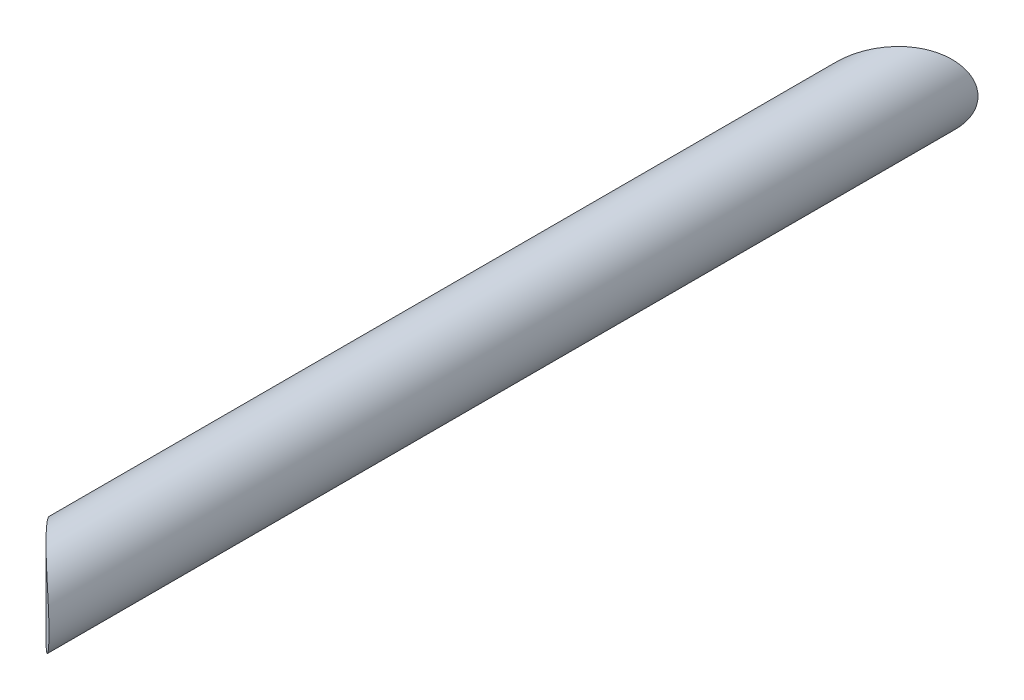
ISO-10303-21;
HEADER;
FILE_DESCRIPTION(('STEP AP214'),'2;1');
FILE_NAME('part.step','',(''),(''),'','','');
FILE_SCHEMA(('AUTOMOTIVE_DESIGN { 1 0 10303 214 1 1 1 1 }'));
ENDSEC;
DATA;
#1=APPLICATION_CONTEXT('core data for automotive mechanical design processes');
#2=APPLICATION_PROTOCOL_DEFINITION('international standard','automotive_design',2000,#1);
#3=PRODUCT_CONTEXT('',#1,'mechanical');
#4=PRODUCT('Part','Part','',(#3));
#5=PRODUCT_RELATED_PRODUCT_CATEGORY('part','',(#4));
#6=PRODUCT_DEFINITION_FORMATION('','',#4);
#7=PRODUCT_DEFINITION_CONTEXT('part definition',#1,'design');
#8=PRODUCT_DEFINITION('design','',#6,#7);
#9=PRODUCT_DEFINITION_SHAPE('','',#8);
#10=(LENGTH_UNIT() NAMED_UNIT(*) SI_UNIT(.MILLI.,.METRE.));
#11=(NAMED_UNIT(*) PLANE_ANGLE_UNIT() SI_UNIT($,.RADIAN.));
#12=(NAMED_UNIT(*) SI_UNIT($,.STERADIAN.) SOLID_ANGLE_UNIT());
#13=UNCERTAINTY_MEASURE_WITH_UNIT(LENGTH_MEASURE(1.E-05),#10,'distance_accuracy_value','');
#14=(GEOMETRIC_REPRESENTATION_CONTEXT(3) GLOBAL_UNCERTAINTY_ASSIGNED_CONTEXT((#13)) GLOBAL_UNIT_ASSIGNED_CONTEXT((#10,
#11,#12)) REPRESENTATION_CONTEXT('',''));
#15=CARTESIAN_POINT('',(0.,0.,0.));
#16=DIRECTION('',(0.,0.,1.));
#17=DIRECTION('',(1.,0.,0.));
#18=AXIS2_PLACEMENT_3D('',#15,#16,#17);
#19=CARTESIAN_POINT('',(-24.9877556700149,5.00000223932676,-32.0000821709314));
#20=DIRECTION('',(0.,0.,1.));
#21=DIRECTION('',(1.,0.,0.));
#22=AXIS2_PLACEMENT_3D('',#19,#20,#21);
#23=CYLINDRICAL_SURFACE('',#22,1.92);
#24=CARTESIAN_POINT('',(-23.0677556700149,5.00000223932676,21.3801329823359));
#25=CARTESIAN_POINT('',(-23.0677613947827,4.91104632216814,21.3801286327776));
#26=CARTESIAN_POINT('',(-23.0739907390176,4.82194466939428,21.3748651270311));
#27=CARTESIAN_POINT('',(-23.0984860418858,4.64652589615371,21.3541138972702));
#28=CARTESIAN_POINT('',(-23.1167811346777,4.56021604732927,21.3386014257683));
#29=CARTESIAN_POINT('',(-23.164047137535,4.39340548545309,21.2983537718751));
#30=CARTESIAN_POINT('',(-23.1929593350612,4.31287568253049,21.2736693018625));
#31=CARTESIAN_POINT('',(-23.259793251646,4.1588059357444,21.2162931039907));
#32=CARTESIAN_POINT('',(-23.2977147900889,4.08526585179513,21.1836015366543));
#33=CARTESIAN_POINT('',(-23.3939778232463,3.92406401065694,21.1000645571534));
#34=CARTESIAN_POINT('',(-23.4549861904529,3.83927536614791,21.0467463719138));
#35=CARTESIAN_POINT('',(-23.585988266444,3.68401891151598,20.9310768996033));
#36=CARTESIAN_POINT('',(-23.6559975055978,3.61357641061974,20.8687099750923));
#37=CARTESIAN_POINT('',(-23.8257322623146,3.46621670049326,20.7157928689081));
#38=CARTESIAN_POINT('',(-23.9277317982889,3.39460837734919,20.6226620675236));
#39=CARTESIAN_POINT('',(-24.1372582212911,3.27440399829337,20.4282590124583));
#40=CARTESIAN_POINT('',(-24.2447928041176,3.22584099753285,20.3269753065446));
#41=CARTESIAN_POINT('',(-24.4959030311924,3.13794020403806,20.0865039778892));
#42=CARTESIAN_POINT('',(-24.6402562285975,3.10620724407717,19.9453492149314));
#43=CARTESIAN_POINT('',(-24.9275277053828,3.07550462393905,19.6581725262452));
#44=CARTESIAN_POINT('',(-25.070444026535,3.0765748493701,19.5121448909711));
#45=CARTESIAN_POINT('',(-25.3535528610892,3.10970897472618,19.2164917155493));
#46=CARTESIAN_POINT('',(-25.4936703170123,3.14224651290957,19.0668453022401));
#47=CARTESIAN_POINT('',(-25.6974704834596,3.21453628587263,18.8444902146728));
#48=CARTESIAN_POINT('',(-25.764344174119,3.24254864275549,18.7707208816286));
#49=CARTESIAN_POINT('',(-25.8955652525379,3.30660042204921,18.6244481240108));
#50=CARTESIAN_POINT('',(-25.959913495804,3.34263709809151,18.5519442754518));
#51=CARTESIAN_POINT('',(-26.1120951881796,3.4400234000073,18.3787254275906));
#52=CARTESIAN_POINT('',(-26.1983895372487,3.50563911116969,18.2790068953553));
#53=CARTESIAN_POINT('',(-26.3626247678305,3.65521506383667,18.0866772677382));
#54=CARTESIAN_POINT('',(-26.4405792665097,3.73914469975471,17.9940546587053));
#55=CARTESIAN_POINT('',(-26.5622002087623,3.89810386560279,17.8478704450801));
#56=CARTESIAN_POINT('',(-26.6089908625457,3.96778497971034,17.7911188157322));
#57=CARTESIAN_POINT('',(-26.6950592814301,4.11742721379481,17.6860014792169));
#58=CARTESIAN_POINT('',(-26.7343487272193,4.1973720212836,17.6376227451617));
#59=CARTESIAN_POINT('',(-26.7947837553629,4.34735076831654,17.5628128755816));
#60=CARTESIAN_POINT('',(-26.8180232200612,4.41528534187375,17.5338961656987));
#61=CARTESIAN_POINT('',(-26.8572147869232,4.55631132998565,17.4849898682634));
#62=CARTESIAN_POINT('',(-26.8731736804272,4.62939786498243,17.4649919616143));
#63=CARTESIAN_POINT('',(-26.8966022111002,4.77971175715369,17.4355942996005));
#64=CARTESIAN_POINT('',(-26.9039999003463,4.85696857771802,17.4262843705982));
#65=CARTESIAN_POINT('',(-26.9092857539173,5.01231359389967,17.4196349006033));
#66=CARTESIAN_POINT('',(-26.907178351741,5.09040138497085,17.422289778816));
#67=CARTESIAN_POINT('',(-26.8945486980452,5.23481268862125,17.4381658231739));
#68=CARTESIAN_POINT('',(-26.8851065390429,5.30139066381093,17.4500306133633));
#69=CARTESIAN_POINT('',(-26.8598467166572,5.43135363890812,17.4816809518838));
#70=CARTESIAN_POINT('',(-26.8440260968907,5.49473714284816,17.5014701731181));
#71=CARTESIAN_POINT('',(-26.7998465094313,5.64075110786631,17.5565220583108));
#72=CARTESIAN_POINT('',(-26.7690065152523,5.72148565559701,17.5948078438309));
#73=CARTESIAN_POINT('',(-26.6993390612836,5.87404667852213,17.6807045638485));
#74=CARTESIAN_POINT('',(-26.6604939767843,5.94585292734037,17.7283360634164));
#75=CARTESIAN_POINT('',(-26.5566524311259,6.11300100935185,17.8546690697647));
#76=CARTESIAN_POINT('',(-26.4880527810273,6.20309753869634,17.9373104556251));
#77=CARTESIAN_POINT('',(-26.341717178853,6.36572141884579,18.1112771706585));
#78=CARTESIAN_POINT('',(-26.2639624238478,6.43821164088501,18.2026202955505));
#79=CARTESIAN_POINT('',(-26.1239812030799,6.5495317032281,18.3647790617914));
#80=CARTESIAN_POINT('',(-26.0633105276035,6.59214819758702,18.4343909626621));
#81=CARTESIAN_POINT('',(-25.939069207489,6.66935969375205,18.5754748619433));
#82=CARTESIAN_POINT('',(-25.8754973239387,6.70395122954149,18.6469476493116));
#83=CARTESIAN_POINT('',(-25.6811340902954,6.7961720683738,18.8631490278091));
#84=CARTESIAN_POINT('',(-25.5466928331074,6.84224939260065,19.0096633381807));
#85=CARTESIAN_POINT('',(-25.2684133558795,6.90484605690015,19.3063245108554));
#86=CARTESIAN_POINT('',(-25.1244312314079,6.9206719385409,19.4564784538429));
#87=CARTESIAN_POINT('',(-24.8331938069343,6.91929089400926,19.7534398947002));
#88=CARTESIAN_POINT('',(-24.6859420495451,6.9021181457424,19.900250695835));
#89=CARTESIAN_POINT('',(-24.4243656722244,6.83928747986027,20.1554159996123));
#90=CARTESIAN_POINT('',(-24.3097941704778,6.80057795271917,20.2652313611008));
#91=CARTESIAN_POINT('',(-24.0846403030306,6.6988259073645,20.4775343054522));
#92=CARTESIAN_POINT('',(-23.9740526864873,6.63581680309222,20.5800317227226));
#93=CARTESIAN_POINT('',(-23.7877728698444,6.5020570250871,20.7501275507322));
#94=CARTESIAN_POINT('',(-23.7101794017518,6.43700530523837,20.8201157938763));
#95=CARTESIAN_POINT('',(-23.5629425098826,6.29112883745776,20.9515793605151));
#96=CARTESIAN_POINT('',(-23.4932886153631,6.2103252536462,21.0130659194234));
#97=CARTESIAN_POINT('',(-23.3783936938892,6.05072183685723,21.1136356826948));
#98=CARTESIAN_POINT('',(-23.3310522034545,5.97471706223837,21.1547426413391));
#99=CARTESIAN_POINT('',(-23.246184064581,5.81339439414608,21.2280345415478));
#100=CARTESIAN_POINT('',(-23.2086520436735,5.7280816349325,21.2602243674452));
#101=CARTESIAN_POINT('',(-23.1498375288629,5.56145741568349,21.3104806801087));
#102=CARTESIAN_POINT('',(-23.1270816290407,5.48105439371249,21.3298349905307));
#103=CARTESIAN_POINT('',(-23.0921603940664,5.31647186370311,21.359483987355));
#104=CARTESIAN_POINT('',(-23.0799684135233,5.23230242359646,21.3698014680868));
#105=CARTESIAN_POINT('',(-23.0715403938817,5.12299920402867,21.3769319271872));
#106=CARTESIAN_POINT('',(-23.0701229925219,5.09844092457235,21.3781308951856));
#107=CARTESIAN_POINT('',(-23.0682297782231,5.04925957380529,21.3797320755271));
#108=CARTESIAN_POINT('',(-23.0677540846747,5.0246364946754,21.3801341868441));
#109=CARTESIAN_POINT('',(-23.0677556700149,5.00000223932676,21.3801329823359));
#110=B_SPLINE_CURVE_WITH_KNOTS('',3,(#24,#25,#26,#27,#28,#29,#30,#31,#32,#33,#34,#35,#36,#37,
#38,#39,#40,#41,#42,#43,#44,#45,#46,#47,#48,#49,#50,#51,#52,#53,#54,#55,#56,#57,#58,#59,#60,#61,
#62,#63,#64,#65,#66,#67,#68,#69,#70,#71,#72,#73,#74,#75,#76,#77,#78,#79,#80,#81,#82,#83,#84,#85,
#86,#87,#88,#89,#90,#91,#92,#93,#94,#95,#96,#97,#98,#99,#100,#101,#102,#103,#104,#105,#106,#107,
#108,#109),.UNSPECIFIED.,.T.,.F.,(4,2,2,2,2,2,2,2,2,2,2,2,2,2,2,2,2,2,2,2,2,2,2,2,2,2,2,2,2,2,2,
2,2,2,2,2,2,2,2,2,2,2,4),(0.,0.266760287659219,0.534167069109944,0.800116829681712,
1.06606125904702,1.41597951086665,1.76650983479163,2.23071858783274,2.69559118292858,
3.30549522037214,3.91614087352063,4.53612320358169,4.84614329977545,5.1560574524856,
5.59665944347265,6.03653067946717,6.33961627959179,6.64222600293591,6.87357532097233,
7.10470839213209,7.33777010290594,7.57072311699441,7.77467925248474,7.97873002944734,
8.26072174476938,8.54334108117575,8.961606646084,9.38074675035782,9.68546115296775,
9.99030691913139,10.5999866278412,11.2234819663698,11.846331875702,12.3347436689117,
12.8224862362494,13.1904776115815,13.5579779217062,13.8524200237347,14.1467005256286,
14.4029386164987,14.658528500324,14.7323921428921,14.8062651493539),.UNSPECIFIED.);
#111=CARTESIAN_POINT('',(-23.0677556700149,5.00000223932676,21.3801329823359));
#112=VERTEX_POINT('',#111);
#113=EDGE_CURVE('E11',#112,#112,#110,.T.);
#114=ORIENTED_EDGE('',*,*,#113,.T.);
#115=EDGE_LOOP('',(#114));
#116=FACE_BOUND('',#115,.T.);
#117=CARTESIAN_POINT('',(-23.0677556700149,5.00000223932676,-21.3802973241987));
#118=CARTESIAN_POINT('',(-23.0677613947827,5.08895815648538,-21.3802929746404));
#119=CARTESIAN_POINT('',(-23.0739907390176,5.17805980925925,-21.3750294688939));
#120=CARTESIAN_POINT('',(-23.0984860418858,5.35347858249982,-21.354278239133));
#121=CARTESIAN_POINT('',(-23.1167811346777,5.43978843132426,-21.3387657676311));
#122=CARTESIAN_POINT('',(-23.164047137535,5.60659899320043,-21.2985181137379));
#123=CARTESIAN_POINT('',(-23.1929593350612,5.68712879612303,-21.2738336437252));
#124=CARTESIAN_POINT('',(-23.259793251646,5.84119854290913,-21.2164574458535));
#125=CARTESIAN_POINT('',(-23.2977147900889,5.91473862685839,-21.1837658785171));
#126=CARTESIAN_POINT('',(-23.3939778232463,6.07594046799658,-21.1002288990162));
#127=CARTESIAN_POINT('',(-23.4549861904529,6.16072911250561,-21.0469107137766));
#128=CARTESIAN_POINT('',(-23.585988266444,6.31598556713754,-20.9312412414661));
#129=CARTESIAN_POINT('',(-23.6559975055978,6.38642806803378,-20.868874316955));
#130=CARTESIAN_POINT('',(-23.8257322623146,6.53378777816027,-20.7159572107708));
#131=CARTESIAN_POINT('',(-23.9277317982889,6.60539610130434,-20.6228264093864));
#132=CARTESIAN_POINT('',(-24.1372582212911,6.72560048036015,-20.4284233543211));
#133=CARTESIAN_POINT('',(-24.2447928041176,6.77416348112067,-20.3271396484073));
#134=CARTESIAN_POINT('',(-24.4959030311924,6.86206427461547,-20.086668319752));
#135=CARTESIAN_POINT('',(-24.6402562285974,6.89379723457635,-19.9455135567941));
#136=CARTESIAN_POINT('',(-24.9275277053828,6.92449985471448,-19.658336868108));
#137=CARTESIAN_POINT('',(-25.070444026535,6.92342962928343,-19.5123092328339));
#138=CARTESIAN_POINT('',(-25.3535528610892,6.89029550392734,-19.216656057412));
#139=CARTESIAN_POINT('',(-25.4936703170123,6.85775796574396,-19.0670096441029));
#140=CARTESIAN_POINT('',(-25.6974704834596,6.78546819278089,-18.8446545565356));
#141=CARTESIAN_POINT('',(-25.764344174119,6.75745583589804,-18.7708852234914));
#142=CARTESIAN_POINT('',(-25.8955652525379,6.69340405660432,-18.6246124658736));
#143=CARTESIAN_POINT('',(-25.959913495804,6.65736738056202,-18.5521086173145));
#144=CARTESIAN_POINT('',(-26.1120951881796,6.55998107864623,-18.3788897694534));
#145=CARTESIAN_POINT('',(-26.1983895372487,6.49436536748384,-18.279171237218));
#146=CARTESIAN_POINT('',(-26.3626247678305,6.34478941481686,-18.086841609601));
#147=CARTESIAN_POINT('',(-26.4405792665097,6.26085977889882,-17.994219000568));
#148=CARTESIAN_POINT('',(-26.5622002087623,6.10190061305074,-17.8480347869429));
#149=CARTESIAN_POINT('',(-26.6089908625457,6.03221949894318,-17.7912831575949));
#150=CARTESIAN_POINT('',(-26.6950592814301,5.88257726485871,-17.6861658210796));
#151=CARTESIAN_POINT('',(-26.7343487272193,5.80263245736992,-17.6377870870244));
#152=CARTESIAN_POINT('',(-26.7947837553629,5.65265371033698,-17.5629772174444));
#153=CARTESIAN_POINT('',(-26.8180232200612,5.58471913677978,-17.5340605075614));
#154=CARTESIAN_POINT('',(-26.8572147869232,5.44369314866788,-17.4851542101261));
#155=CARTESIAN_POINT('',(-26.8731736804272,5.3706066136711,-17.465156303477));
#156=CARTESIAN_POINT('',(-26.8966022111002,5.22029272149983,-17.4357586414633));
#157=CARTESIAN_POINT('',(-26.9039999003463,5.14303590093551,-17.426448712461));
#158=CARTESIAN_POINT('',(-26.9092857539173,4.98769088475386,-17.419799242466));
#159=CARTESIAN_POINT('',(-26.907178351741,4.90960309368267,-17.4224541206787));
#160=CARTESIAN_POINT('',(-26.8945486980452,4.76519179003228,-17.4383301650366));
#161=CARTESIAN_POINT('',(-26.8851065390429,4.6986138148426,-17.450194955226));
#162=CARTESIAN_POINT('',(-26.8598467166572,4.56865083974541,-17.4818452937465));
#163=CARTESIAN_POINT('',(-26.8440260968907,4.50526733580537,-17.5016345149808));
#164=CARTESIAN_POINT('',(-26.7998465094313,4.35925337078722,-17.5566864001735));
#165=CARTESIAN_POINT('',(-26.7690065152523,4.27851882305651,-17.5949721856937));
#166=CARTESIAN_POINT('',(-26.6993390612836,4.12595780013139,-17.6808689057112));
#167=CARTESIAN_POINT('',(-26.6604939767843,4.05415155131316,-17.7285004052791));
#168=CARTESIAN_POINT('',(-26.5566524311259,3.88700346930168,-17.8548334116275));
#169=CARTESIAN_POINT('',(-26.4880527810273,3.79690693995719,-17.9374747974879));
#170=CARTESIAN_POINT('',(-26.341717178853,3.63428305980774,-18.1114415125213));
#171=CARTESIAN_POINT('',(-26.2639624238478,3.56179283776852,-18.2027846374132));
#172=CARTESIAN_POINT('',(-26.1239812030799,3.45047277542543,-18.3649434036541));
#173=CARTESIAN_POINT('',(-26.0633105276036,3.40785628106651,-18.4345553045248));
#174=CARTESIAN_POINT('',(-25.9390692074891,3.33064478490148,-18.575639203806));
#175=CARTESIAN_POINT('',(-25.8754973239387,3.29605324911204,-18.6471119911743));
#176=CARTESIAN_POINT('',(-25.6811340902954,3.20383241027973,-18.8633133696718));
#177=CARTESIAN_POINT('',(-25.5466928331074,3.15775508605287,-19.0098276800435));
#178=CARTESIAN_POINT('',(-25.2684133558795,3.09515842175338,-19.3064888527181));
#179=CARTESIAN_POINT('',(-25.1244312314079,3.07933254011263,-19.4566427957056));
#180=CARTESIAN_POINT('',(-24.8331938069343,3.08071358464427,-19.7536042365629));
#181=CARTESIAN_POINT('',(-24.6859420495451,3.09788633291112,-19.9004150376977));
#182=CARTESIAN_POINT('',(-24.4243656722244,3.16071699879325,-20.155580341475));
#183=CARTESIAN_POINT('',(-24.3097941704778,3.19942652593435,-20.2653957029636));
#184=CARTESIAN_POINT('',(-24.0846403030306,3.30117857128902,-20.4776986473149));
#185=CARTESIAN_POINT('',(-23.9740526864873,3.3641876755613,-20.5801960645854));
#186=CARTESIAN_POINT('',(-23.7877728698444,3.49794745356642,-20.750291892595));
#187=CARTESIAN_POINT('',(-23.7101794017518,3.56299917341515,-20.8202801357391));
#188=CARTESIAN_POINT('',(-23.5629425098826,3.70887564119576,-20.9517437023779));
#189=CARTESIAN_POINT('',(-23.4932886153631,3.78967922500732,-21.0132302612862));
#190=CARTESIAN_POINT('',(-23.3783936938892,3.94928264179628,-21.1138000245575));
#191=CARTESIAN_POINT('',(-23.3310522034545,4.02528741641515,-21.1549069832018));
#192=CARTESIAN_POINT('',(-23.246184064581,4.18661008450744,-21.2281988834105));
#193=CARTESIAN_POINT('',(-23.2086520436735,4.27192284372102,-21.260388709308));
#194=CARTESIAN_POINT('',(-23.1498375288629,4.43854706297003,-21.3106450219715));
#195=CARTESIAN_POINT('',(-23.1270816290407,4.51895008494103,-21.3299993323934));
#196=CARTESIAN_POINT('',(-23.0921603940664,4.6835326149504,-21.3596483292178));
#197=CARTESIAN_POINT('',(-23.0799684135233,4.76770205505706,-21.3699658099495));
#198=CARTESIAN_POINT('',(-23.0715403938817,4.87700527462485,-21.3770962690499));
#199=CARTESIAN_POINT('',(-23.0701229925219,4.90156355408117,-21.3782952370483));
#200=CARTESIAN_POINT('',(-23.0682297782231,4.95074490484823,-21.3798964173899));
#201=CARTESIAN_POINT('',(-23.0677540846747,4.97536798397813,-21.3802985287068));
#202=CARTESIAN_POINT('',(-23.0677556700149,5.00000223932676,-21.3802973241987));
#203=B_SPLINE_CURVE_WITH_KNOTS('',3,(#117,#118,#119,#120,#121,#122,#123,#124,#125,#126,#127,
#128,#129,#130,#131,#132,#133,#134,#135,#136,#137,#138,#139,#140,#141,#142,#143,#144,#145,#146,
#147,#148,#149,#150,#151,#152,#153,#154,#155,#156,#157,#158,#159,#160,#161,#162,#163,#164,#165,
#166,#167,#168,#169,#170,#171,#172,#173,#174,#175,#176,#177,#178,#179,#180,#181,#182,#183,#184,
#185,#186,#187,#188,#189,#190,#191,#192,#193,#194,#195,#196,#197,#198,#199,#200,#201,#202),
.UNSPECIFIED.,.T.,.F.,(4,2,2,2,2,2,2,2,2,2,2,2,2,2,2,2,2,2,2,2,2,2,2,2,2,2,2,2,2,2,2,2,2,2,2,2,
2,2,2,2,2,2,4),(0.,0.26676028765922,0.534167069109943,0.800116829681712,1.06606125904702,
1.41597951086665,1.76650983479163,2.23071858783274,2.69559118292857,3.30549522037214,
3.91614087352062,4.53612320358169,4.84614329977545,5.1560574524856,5.59665944347265,
6.03653067946717,6.33961627959179,6.64222600293591,6.87357532097233,7.10470839213209,
7.33777010290594,7.57072311699441,7.77467925248474,7.97873002944734,8.26072174476938,
8.54334108117574,8.96160664608399,9.3807467503578,9.68546115296773,9.99030691913137,
10.5999866278412,11.2234819663698,11.846331875702,12.3347436689117,12.8224862362494,
13.1904776115815,13.5579779217062,13.8524200237347,14.1467005256286,14.4029386164987,
14.658528500324,14.7323921428921,14.8062651493539),.UNSPECIFIED.);
#204=CARTESIAN_POINT('',(-23.0677556700149,5.00000223932676,-21.3802973241987));
#205=VERTEX_POINT('',#204);
#206=EDGE_CURVE('E47',#205,#205,#203,.T.);
#207=ORIENTED_EDGE('',*,*,#206,.T.);
#208=EDGE_LOOP('',(#207));
#209=FACE_BOUND('',#208,.T.);
#210=ADVANCED_FACE('F44',(#116,#209),#23,.T.);
#211=CARTESIAN_POINT('',(-4.98775567001487,6.92080223932676,-8.21709313762335E-05));
#212=DIRECTION('',(0.,-1.,0.));
#213=DIRECTION('',(0.,0.,-1.));
#214=AXIS2_PLACEMENT_3D('',#211,#212,#213);
#215=CYLINDRICAL_SURFACE('',#214,28.);
#216=ORIENTED_EDGE('',*,*,#206,.F.);
#217=EDGE_LOOP('',(#216));
#218=FACE_BOUND('',#217,.T.);
#219=ADVANCED_FACE('F69',(#218),#215,.T.);
#220=CARTESIAN_POINT('',(-4.98775567001487,6.92080223932676,-8.21709313762335E-05));
#221=DIRECTION('',(0.,-1.,0.));
#222=DIRECTION('',(0.,0.,-1.));
#223=AXIS2_PLACEMENT_3D('',#220,#221,#222);
#224=CYLINDRICAL_SURFACE('',#223,28.);
#225=ORIENTED_EDGE('',*,*,#113,.F.);
#226=EDGE_LOOP('',(#225));
#227=FACE_BOUND('',#226,.T.);
#228=ADVANCED_FACE('F65',(#227),#224,.T.);
#229=CLOSED_SHELL('',(#210,#219,#228));
#230=MANIFOLD_SOLID_BREP('B2',#229);
#231=ADVANCED_BREP_SHAPE_REPRESENTATION('',(#18,#230),#14);
#232=SHAPE_DEFINITION_REPRESENTATION(#9,#231);
ENDSEC;
END-ISO-10303-21;
